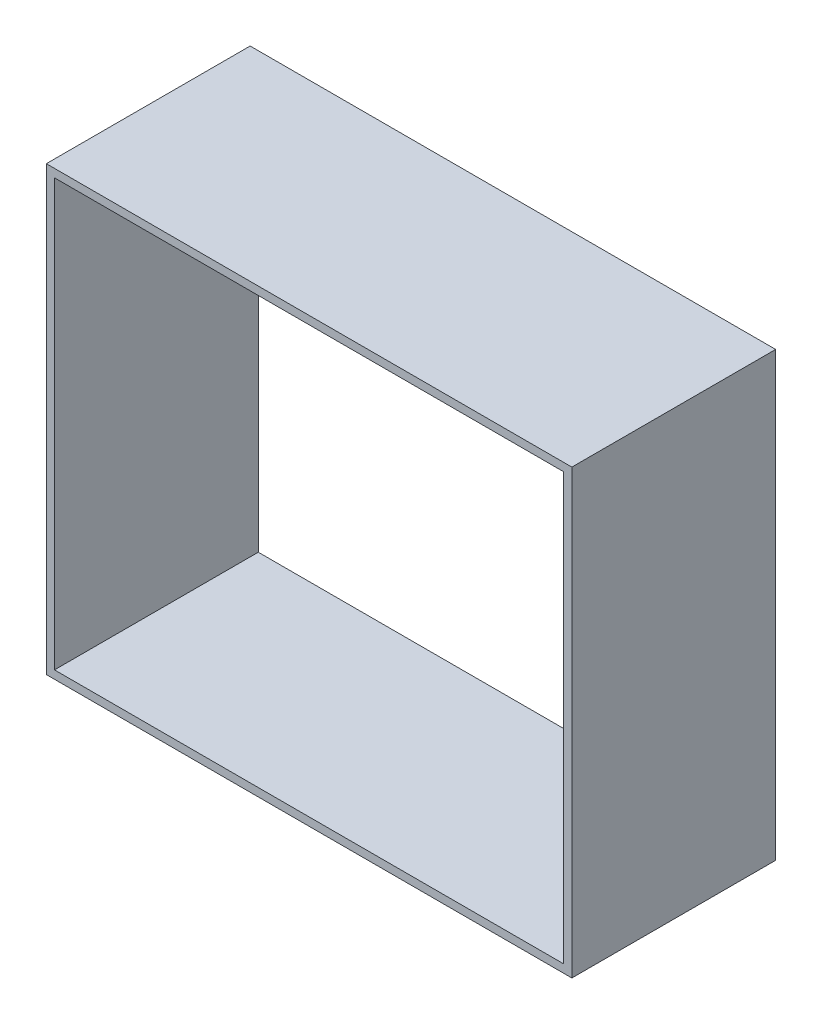
ISO-10303-21;
HEADER;
FILE_DESCRIPTION(('STEP AP214'),'2;1');
FILE_NAME('part.step','',(''),(''),'','','');
FILE_SCHEMA(('AUTOMOTIVE_DESIGN { 1 0 10303 214 1 1 1 1 }'));
ENDSEC;
DATA;
#1=APPLICATION_CONTEXT('core data for automotive mechanical design processes');
#2=APPLICATION_PROTOCOL_DEFINITION('international standard','automotive_design',2000,#1);
#3=PRODUCT_CONTEXT('',#1,'mechanical');
#4=PRODUCT('Part','Part','',(#3));
#5=PRODUCT_RELATED_PRODUCT_CATEGORY('part','',(#4));
#6=PRODUCT_DEFINITION_FORMATION('','',#4);
#7=PRODUCT_DEFINITION_CONTEXT('part definition',#1,'design');
#8=PRODUCT_DEFINITION('design','',#6,#7);
#9=PRODUCT_DEFINITION_SHAPE('','',#8);
#10=(LENGTH_UNIT() NAMED_UNIT(*) SI_UNIT(.MILLI.,.METRE.));
#11=(NAMED_UNIT(*) PLANE_ANGLE_UNIT() SI_UNIT($,.RADIAN.));
#12=(NAMED_UNIT(*) SI_UNIT($,.STERADIAN.) SOLID_ANGLE_UNIT());
#13=UNCERTAINTY_MEASURE_WITH_UNIT(LENGTH_MEASURE(1.E-05),#10,'distance_accuracy_value','');
#14=(GEOMETRIC_REPRESENTATION_CONTEXT(3) GLOBAL_UNCERTAINTY_ASSIGNED_CONTEXT((#13)) GLOBAL_UNIT_ASSIGNED_CONTEXT((#10,
#11,#12)) REPRESENTATION_CONTEXT('',''));
#15=CARTESIAN_POINT('',(0.,0.,0.));
#16=DIRECTION('',(0.,0.,1.));
#17=DIRECTION('',(1.,0.,0.));
#18=AXIS2_PLACEMENT_3D('',#15,#16,#17);
#19=CARTESIAN_POINT('',(0.,0.,50.));
#20=DIRECTION('',(0.,0.,-1.));
#21=DIRECTION('',(-1.,0.,0.));
#22=AXIS2_PLACEMENT_3D('',#19,#20,#21);
#23=PLANE('',#22);
#24=DIRECTION('',(-1.,0.,0.));
#25=VECTOR('',#24,1.);
#26=CARTESIAN_POINT('',(-64.4613113559961,54.2737712685208,50.));
#27=LINE('',#26,#25);
#28=CARTESIAN_POINT('',(64.4613113559961,54.2737712685208,50.));
#29=VERTEX_POINT('',#28);
#30=CARTESIAN_POINT('',(-64.4613113559961,54.2737712685208,50.));
#31=VERTEX_POINT('',#30);
#32=EDGE_CURVE('E134',#29,#31,#27,.T.);
#33=ORIENTED_EDGE('',*,*,#32,.T.);
#34=DIRECTION('',(0.,-1.,0.));
#35=VECTOR('',#34,1.);
#36=CARTESIAN_POINT('',(-64.4613113559961,54.2737712685208,50.));
#37=LINE('',#36,#35);
#38=CARTESIAN_POINT('',(-64.4613113559961,-54.2737712685208,50.));
#39=VERTEX_POINT('',#38);
#40=EDGE_CURVE('E137',#31,#39,#37,.T.);
#41=ORIENTED_EDGE('',*,*,#40,.T.);
#42=DIRECTION('',(1.,0.,0.));
#43=VECTOR('',#42,1.);
#44=CARTESIAN_POINT('',(-64.4613113559961,-54.2737712685208,50.));
#45=LINE('',#44,#43);
#46=CARTESIAN_POINT('',(64.4613113559961,-54.2737712685208,50.));
#47=VERTEX_POINT('',#46);
#48=EDGE_CURVE('E140',#39,#47,#45,.T.);
#49=ORIENTED_EDGE('',*,*,#48,.T.);
#50=DIRECTION('',(0.,1.,0.));
#51=VECTOR('',#50,1.);
#52=CARTESIAN_POINT('',(64.4613113559961,54.2737712685208,50.));
#53=LINE('',#52,#51);
#54=EDGE_CURVE('E142',#47,#29,#53,.T.);
#55=ORIENTED_EDGE('',*,*,#54,.T.);
#56=EDGE_LOOP('',(#33,#41,#49,#55));
#57=FACE_BOUND('',#56,.T.);
#58=DIRECTION('',(0.,1.,0.));
#59=VECTOR('',#58,1.);
#60=CARTESIAN_POINT('',(62.4613113559961,52.2737712685208,50.));
#61=LINE('',#60,#59);
#62=CARTESIAN_POINT('',(62.4613113559961,-52.2737712685208,50.));
#63=VERTEX_POINT('',#62);
#64=CARTESIAN_POINT('',(62.4613113559961,52.2737712685208,50.));
#65=VERTEX_POINT('',#64);
#66=EDGE_CURVE('E98',#63,#65,#61,.T.);
#67=ORIENTED_EDGE('',*,*,#66,.F.);
#68=DIRECTION('',(1.,0.,0.));
#69=VECTOR('',#68,1.);
#70=CARTESIAN_POINT('',(-62.4613113559961,-52.2737712685208,50.));
#71=LINE('',#70,#69);
#72=CARTESIAN_POINT('',(-62.4613113559961,-52.2737712685208,50.));
#73=VERTEX_POINT('',#72);
#74=EDGE_CURVE('E120',#73,#63,#71,.T.);
#75=ORIENTED_EDGE('',*,*,#74,.F.);
#76=DIRECTION('',(0.,-1.,0.));
#77=VECTOR('',#76,1.);
#78=CARTESIAN_POINT('',(-62.4613113559961,52.2737712685208,50.));
#79=LINE('',#78,#77);
#80=CARTESIAN_POINT('',(-62.4613113559961,52.2737712685208,50.));
#81=VERTEX_POINT('',#80);
#82=EDGE_CURVE('E118',#81,#73,#79,.T.);
#83=ORIENTED_EDGE('',*,*,#82,.F.);
#84=DIRECTION('',(-1.,0.,0.));
#85=VECTOR('',#84,1.);
#86=CARTESIAN_POINT('',(-62.4613113559961,52.2737712685208,50.));
#87=LINE('',#86,#85);
#88=EDGE_CURVE('E106',#65,#81,#87,.T.);
#89=ORIENTED_EDGE('',*,*,#88,.F.);
#90=EDGE_LOOP('',(#67,#75,#83,#89));
#91=FACE_BOUND('',#90,.T.);
#92=ADVANCED_FACE('F33',(#57,#91),#23,.F.);
#93=CARTESIAN_POINT('',(0.,0.,0.));
#94=DIRECTION('',(0.,0.,-1.));
#95=DIRECTION('',(-1.,0.,0.));
#96=AXIS2_PLACEMENT_3D('',#93,#94,#95);
#97=PLANE('',#96);
#98=DIRECTION('',(-1.,0.,0.));
#99=VECTOR('',#98,1.);
#100=CARTESIAN_POINT('',(-64.4613113559961,54.2737712685208,0.));
#101=LINE('',#100,#99);
#102=CARTESIAN_POINT('',(64.4613113559961,54.2737712685208,0.));
#103=VERTEX_POINT('',#102);
#104=CARTESIAN_POINT('',(-64.4613113559961,54.2737712685208,0.));
#105=VERTEX_POINT('',#104);
#106=EDGE_CURVE('E114',#103,#105,#101,.T.);
#107=ORIENTED_EDGE('',*,*,#106,.F.);
#108=DIRECTION('',(0.,1.,0.));
#109=VECTOR('',#108,1.);
#110=CARTESIAN_POINT('',(64.4613113559961,54.2737712685208,0.));
#111=LINE('',#110,#109);
#112=CARTESIAN_POINT('',(64.4613113559961,-54.2737712685208,0.));
#113=VERTEX_POINT('',#112);
#114=EDGE_CURVE('E138',#113,#103,#111,.T.);
#115=ORIENTED_EDGE('',*,*,#114,.F.);
#116=DIRECTION('',(1.,0.,0.));
#117=VECTOR('',#116,1.);
#118=CARTESIAN_POINT('',(-64.4613113559961,-54.2737712685208,0.));
#119=LINE('',#118,#117);
#120=CARTESIAN_POINT('',(-64.4613113559961,-54.2737712685208,0.));
#121=VERTEX_POINT('',#120);
#122=EDGE_CURVE('E149',#121,#113,#119,.T.);
#123=ORIENTED_EDGE('',*,*,#122,.F.);
#124=DIRECTION('',(0.,-1.,0.));
#125=VECTOR('',#124,1.);
#126=CARTESIAN_POINT('',(-64.4613113559961,54.2737712685208,0.));
#127=LINE('',#126,#125);
#128=EDGE_CURVE('E147',#105,#121,#127,.T.);
#129=ORIENTED_EDGE('',*,*,#128,.F.);
#130=EDGE_LOOP('',(#107,#115,#123,#129));
#131=FACE_BOUND('',#130,.T.);
#132=DIRECTION('',(1.,0.,0.));
#133=VECTOR('',#132,1.);
#134=CARTESIAN_POINT('',(-62.4613113559961,-52.2737712685208,0.));
#135=LINE('',#134,#133);
#136=CARTESIAN_POINT('',(-62.4613113559961,-52.2737712685208,0.));
#137=VERTEX_POINT('',#136);
#138=CARTESIAN_POINT('',(62.4613113559961,-52.2737712685208,0.));
#139=VERTEX_POINT('',#138);
#140=EDGE_CURVE('E107',#137,#139,#135,.T.);
#141=ORIENTED_EDGE('',*,*,#140,.T.);
#142=DIRECTION('',(0.,1.,0.));
#143=VECTOR('',#142,1.);
#144=CARTESIAN_POINT('',(62.4613113559961,52.2737712685208,0.));
#145=LINE('',#144,#143);
#146=CARTESIAN_POINT('',(62.4613113559961,52.2737712685208,0.));
#147=VERTEX_POINT('',#146);
#148=EDGE_CURVE('E56',#139,#147,#145,.T.);
#149=ORIENTED_EDGE('',*,*,#148,.T.);
#150=DIRECTION('',(-1.,0.,0.));
#151=VECTOR('',#150,1.);
#152=CARTESIAN_POINT('',(-62.4613113559961,52.2737712685208,0.));
#153=LINE('',#152,#151);
#154=CARTESIAN_POINT('',(-62.4613113559961,52.2737712685208,0.));
#155=VERTEX_POINT('',#154);
#156=EDGE_CURVE('E113',#147,#155,#153,.T.);
#157=ORIENTED_EDGE('',*,*,#156,.T.);
#158=DIRECTION('',(0.,-1.,0.));
#159=VECTOR('',#158,1.);
#160=CARTESIAN_POINT('',(-62.4613113559961,52.2737712685208,0.));
#161=LINE('',#160,#159);
#162=EDGE_CURVE('E126',#155,#137,#161,.T.);
#163=ORIENTED_EDGE('',*,*,#162,.T.);
#164=EDGE_LOOP('',(#141,#149,#157,#163));
#165=FACE_BOUND('',#164,.T.);
#166=ADVANCED_FACE('F167',(#131,#165),#97,.T.);
#167=CARTESIAN_POINT('',(-64.4613113559961,54.2737712685208,50.));
#168=DIRECTION('',(0.,-1.,0.));
#169=DIRECTION('',(0.,0.,-1.));
#170=AXIS2_PLACEMENT_3D('',#167,#168,#169);
#171=PLANE('',#170);
#172=ORIENTED_EDGE('',*,*,#106,.T.);
#173=DIRECTION('',(0.,0.,-1.));
#174=VECTOR('',#173,1.);
#175=CARTESIAN_POINT('',(-64.4613113559961,54.2737712685208,50.));
#176=LINE('',#175,#174);
#177=EDGE_CURVE('E11',#31,#105,#176,.T.);
#178=ORIENTED_EDGE('',*,*,#177,.F.);
#179=ORIENTED_EDGE('',*,*,#32,.F.);
#180=DIRECTION('',(0.,0.,-1.));
#181=VECTOR('',#180,1.);
#182=CARTESIAN_POINT('',(64.4613113559961,54.2737712685208,50.));
#183=LINE('',#182,#181);
#184=EDGE_CURVE('E144',#29,#103,#183,.T.);
#185=ORIENTED_EDGE('',*,*,#184,.T.);
#186=EDGE_LOOP('',(#172,#178,#179,#185));
#187=FACE_BOUND('',#186,.T.);
#188=ADVANCED_FACE('F35',(#187),#171,.F.);
#189=CARTESIAN_POINT('',(-64.4613113559961,54.2737712685208,50.));
#190=DIRECTION('',(1.,0.,0.));
#191=DIRECTION('',(0.,0.,-1.));
#192=AXIS2_PLACEMENT_3D('',#189,#190,#191);
#193=PLANE('',#192);
#194=ORIENTED_EDGE('',*,*,#128,.T.);
#195=DIRECTION('',(0.,0.,-1.));
#196=VECTOR('',#195,1.);
#197=CARTESIAN_POINT('',(-64.4613113559961,-54.2737712685208,50.));
#198=LINE('',#197,#196);
#199=EDGE_CURVE('E41',#39,#121,#198,.T.);
#200=ORIENTED_EDGE('',*,*,#199,.F.);
#201=ORIENTED_EDGE('',*,*,#40,.F.);
#202=ORIENTED_EDGE('',*,*,#177,.T.);
#203=EDGE_LOOP('',(#194,#200,#201,#202));
#204=FACE_BOUND('',#203,.T.);
#205=ADVANCED_FACE('F177',(#204),#193,.F.);
#206=CARTESIAN_POINT('',(-64.4613113559961,-54.2737712685208,50.));
#207=DIRECTION('',(0.,1.,0.));
#208=DIRECTION('',(0.,0.,1.));
#209=AXIS2_PLACEMENT_3D('',#206,#207,#208);
#210=PLANE('',#209);
#211=ORIENTED_EDGE('',*,*,#122,.T.);
#212=DIRECTION('',(0.,0.,-1.));
#213=VECTOR('',#212,1.);
#214=CARTESIAN_POINT('',(64.4613113559961,-54.2737712685208,50.));
#215=LINE('',#214,#213);
#216=EDGE_CURVE('E154',#47,#113,#215,.T.);
#217=ORIENTED_EDGE('',*,*,#216,.F.);
#218=ORIENTED_EDGE('',*,*,#48,.F.);
#219=ORIENTED_EDGE('',*,*,#199,.T.);
#220=EDGE_LOOP('',(#211,#217,#218,#219));
#221=FACE_BOUND('',#220,.T.);
#222=ADVANCED_FACE('F161',(#221),#210,.F.);
#223=CARTESIAN_POINT('',(64.4613113559961,54.2737712685208,50.));
#224=DIRECTION('',(-1.,0.,0.));
#225=DIRECTION('',(0.,0.,1.));
#226=AXIS2_PLACEMENT_3D('',#223,#224,#225);
#227=PLANE('',#226);
#228=ORIENTED_EDGE('',*,*,#114,.T.);
#229=ORIENTED_EDGE('',*,*,#184,.F.);
#230=ORIENTED_EDGE('',*,*,#54,.F.);
#231=ORIENTED_EDGE('',*,*,#216,.T.);
#232=EDGE_LOOP('',(#228,#229,#230,#231));
#233=FACE_BOUND('',#232,.T.);
#234=ADVANCED_FACE('F171',(#233),#227,.F.);
#235=CARTESIAN_POINT('',(62.4613113559961,52.2737712685208,50.));
#236=DIRECTION('',(-1.,0.,0.));
#237=DIRECTION('',(0.,0.,1.));
#238=AXIS2_PLACEMENT_3D('',#235,#236,#237);
#239=PLANE('',#238);
#240=ORIENTED_EDGE('',*,*,#148,.F.);
#241=DIRECTION('',(0.,0.,-1.));
#242=VECTOR('',#241,1.);
#243=CARTESIAN_POINT('',(62.4613113559961,-52.2737712685208,50.));
#244=LINE('',#243,#242);
#245=EDGE_CURVE('E102',#63,#139,#244,.T.);
#246=ORIENTED_EDGE('',*,*,#245,.F.);
#247=ORIENTED_EDGE('',*,*,#66,.T.);
#248=DIRECTION('',(0.,0.,-1.));
#249=VECTOR('',#248,1.);
#250=CARTESIAN_POINT('',(62.4613113559961,52.2737712685208,50.));
#251=LINE('',#250,#249);
#252=EDGE_CURVE('E101',#65,#147,#251,.T.);
#253=ORIENTED_EDGE('',*,*,#252,.T.);
#254=EDGE_LOOP('',(#240,#246,#247,#253));
#255=FACE_BOUND('',#254,.T.);
#256=ADVANCED_FACE('F100',(#255),#239,.T.);
#257=CARTESIAN_POINT('',(-62.4613113559961,52.2737712685208,50.));
#258=DIRECTION('',(0.,-1.,0.));
#259=DIRECTION('',(0.,0.,-1.));
#260=AXIS2_PLACEMENT_3D('',#257,#258,#259);
#261=PLANE('',#260);
#262=ORIENTED_EDGE('',*,*,#156,.F.);
#263=ORIENTED_EDGE('',*,*,#252,.F.);
#264=ORIENTED_EDGE('',*,*,#88,.T.);
#265=DIRECTION('',(0.,0.,-1.));
#266=VECTOR('',#265,1.);
#267=CARTESIAN_POINT('',(-62.4613113559961,52.2737712685208,50.));
#268=LINE('',#267,#266);
#269=EDGE_CURVE('E115',#81,#155,#268,.T.);
#270=ORIENTED_EDGE('',*,*,#269,.T.);
#271=EDGE_LOOP('',(#262,#263,#264,#270));
#272=FACE_BOUND('',#271,.T.);
#273=ADVANCED_FACE('F110',(#272),#261,.T.);
#274=CARTESIAN_POINT('',(-62.4613113559961,52.2737712685208,50.));
#275=DIRECTION('',(1.,0.,0.));
#276=DIRECTION('',(0.,0.,-1.));
#277=AXIS2_PLACEMENT_3D('',#274,#275,#276);
#278=PLANE('',#277);
#279=ORIENTED_EDGE('',*,*,#162,.F.);
#280=ORIENTED_EDGE('',*,*,#269,.F.);
#281=ORIENTED_EDGE('',*,*,#82,.T.);
#282=DIRECTION('',(0.,0.,-1.));
#283=VECTOR('',#282,1.);
#284=CARTESIAN_POINT('',(-62.4613113559961,-52.2737712685208,50.));
#285=LINE('',#284,#283);
#286=EDGE_CURVE('E48',#73,#137,#285,.T.);
#287=ORIENTED_EDGE('',*,*,#286,.T.);
#288=EDGE_LOOP('',(#279,#280,#281,#287));
#289=FACE_BOUND('',#288,.T.);
#290=ADVANCED_FACE('F200',(#289),#278,.T.);
#291=CARTESIAN_POINT('',(-62.4613113559961,-52.2737712685208,50.));
#292=DIRECTION('',(0.,1.,0.));
#293=DIRECTION('',(0.,0.,1.));
#294=AXIS2_PLACEMENT_3D('',#291,#292,#293);
#295=PLANE('',#294);
#296=ORIENTED_EDGE('',*,*,#140,.F.);
#297=ORIENTED_EDGE('',*,*,#286,.F.);
#298=ORIENTED_EDGE('',*,*,#74,.T.);
#299=ORIENTED_EDGE('',*,*,#245,.T.);
#300=EDGE_LOOP('',(#296,#297,#298,#299));
#301=FACE_BOUND('',#300,.T.);
#302=ADVANCED_FACE('F204',(#301),#295,.T.);
#303=CLOSED_SHELL('',(#92,#166,#188,#205,#222,#234,#256,#273,#290,#302));
#304=MANIFOLD_SOLID_BREP('B2',#303);
#305=ADVANCED_BREP_SHAPE_REPRESENTATION('',(#18,#304),#14);
#306=SHAPE_DEFINITION_REPRESENTATION(#9,#305);
ENDSEC;
END-ISO-10303-21;
